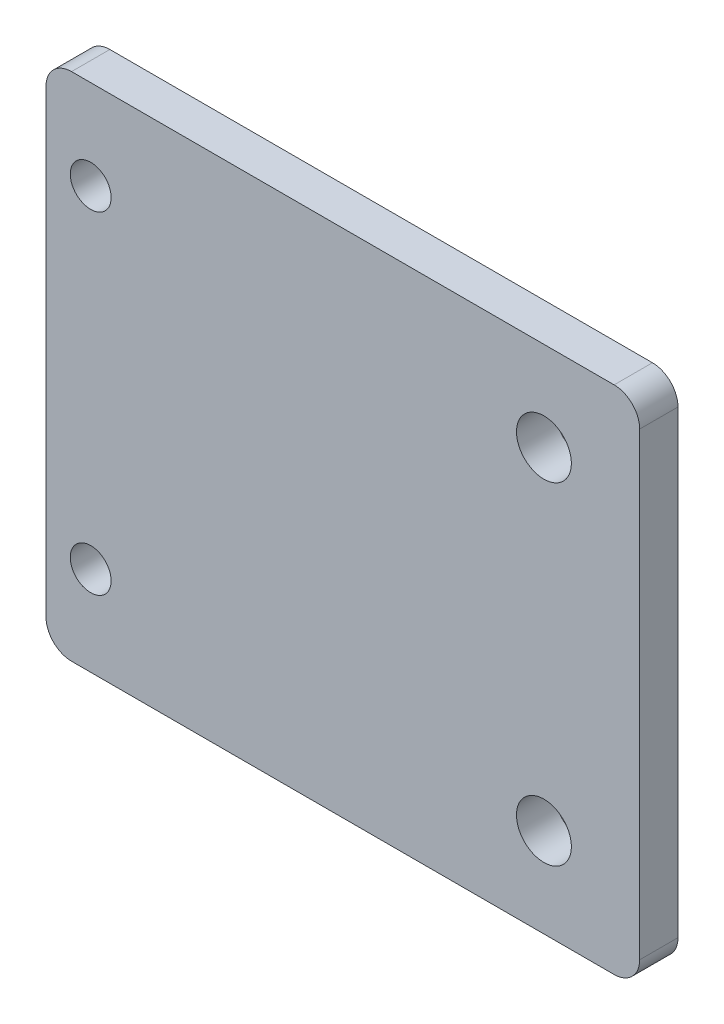
ISO-10303-21;
HEADER;
FILE_DESCRIPTION(('STEP AP214'),'2;1');
FILE_NAME('part.step','',(''),(''),'','','');
FILE_SCHEMA(('AUTOMOTIVE_DESIGN { 1 0 10303 214 1 1 1 1 }'));
ENDSEC;
DATA;
#1=APPLICATION_CONTEXT('core data for automotive mechanical design processes');
#2=APPLICATION_PROTOCOL_DEFINITION('international standard','automotive_design',2000,#1);
#3=PRODUCT_CONTEXT('',#1,'mechanical');
#4=PRODUCT('Part','Part','',(#3));
#5=PRODUCT_RELATED_PRODUCT_CATEGORY('part','',(#4));
#6=PRODUCT_DEFINITION_FORMATION('','',#4);
#7=PRODUCT_DEFINITION_CONTEXT('part definition',#1,'design');
#8=PRODUCT_DEFINITION('design','',#6,#7);
#9=PRODUCT_DEFINITION_SHAPE('','',#8);
#10=(LENGTH_UNIT() NAMED_UNIT(*) SI_UNIT(.MILLI.,.METRE.));
#11=(NAMED_UNIT(*) PLANE_ANGLE_UNIT() SI_UNIT($,.RADIAN.));
#12=(NAMED_UNIT(*) SI_UNIT($,.STERADIAN.) SOLID_ANGLE_UNIT());
#13=UNCERTAINTY_MEASURE_WITH_UNIT(LENGTH_MEASURE(1.E-05),#10,'distance_accuracy_value','');
#14=(GEOMETRIC_REPRESENTATION_CONTEXT(3) GLOBAL_UNCERTAINTY_ASSIGNED_CONTEXT((#13)) GLOBAL_UNIT_ASSIGNED_CONTEXT((#10,
#11,#12)) REPRESENTATION_CONTEXT('',''));
#15=CARTESIAN_POINT('',(0.,0.,0.));
#16=DIRECTION('',(0.,0.,1.));
#17=DIRECTION('',(1.,0.,0.));
#18=AXIS2_PLACEMENT_3D('',#15,#16,#17);
#19=CARTESIAN_POINT('',(-23.25,-20.,3.));
#20=DIRECTION('',(1.,0.,0.));
#21=DIRECTION('',(0.,0.,-1.));
#22=AXIS2_PLACEMENT_3D('',#19,#20,#21);
#23=PLANE('',#22);
#24=DIRECTION('',(0.,-1.,0.));
#25=VECTOR('',#24,1.);
#26=CARTESIAN_POINT('',(-23.25,-20.,0.));
#27=LINE('',#26,#25);
#28=CARTESIAN_POINT('',(-23.25,18.,0.));
#29=VERTEX_POINT('',#28);
#30=CARTESIAN_POINT('',(-23.25,-18.,0.));
#31=VERTEX_POINT('',#30);
#32=EDGE_CURVE('E174',#29,#31,#27,.T.);
#33=ORIENTED_EDGE('',*,*,#32,.T.);
#34=DIRECTION('',(0.,0.,-1.));
#35=VECTOR('',#34,1.);
#36=CARTESIAN_POINT('',(-23.25,-18.,3.));
#37=LINE('',#36,#35);
#38=CARTESIAN_POINT('',(-23.25,-18.,3.));
#39=VERTEX_POINT('',#38);
#40=EDGE_CURVE('E11',#31,#39,#37,.F.);
#41=ORIENTED_EDGE('',*,*,#40,.T.);
#42=DIRECTION('',(0.,-1.,0.));
#43=VECTOR('',#42,1.);
#44=CARTESIAN_POINT('',(-23.25,-20.,3.));
#45=LINE('',#44,#43);
#46=CARTESIAN_POINT('',(-23.25,18.,3.));
#47=VERTEX_POINT('',#46);
#48=EDGE_CURVE('E129',#47,#39,#45,.T.);
#49=ORIENTED_EDGE('',*,*,#48,.F.);
#50=DIRECTION('',(0.,0.,-1.));
#51=VECTOR('',#50,1.);
#52=CARTESIAN_POINT('',(-23.25,18.,3.));
#53=LINE('',#52,#51);
#54=EDGE_CURVE('E45',#47,#29,#53,.T.);
#55=ORIENTED_EDGE('',*,*,#54,.T.);
#56=EDGE_LOOP('',(#33,#41,#49,#55));
#57=FACE_BOUND('',#56,.T.);
#58=ADVANCED_FACE('F37',(#57),#23,.F.);
#59=CARTESIAN_POINT('',(23.25,-20.,3.));
#60=DIRECTION('',(0.,1.,0.));
#61=DIRECTION('',(-1.,0.,0.));
#62=AXIS2_PLACEMENT_3D('',#59,#60,#61);
#63=PLANE('',#62);
#64=DIRECTION('',(1.,0.,0.));
#65=VECTOR('',#64,1.);
#66=CARTESIAN_POINT('',(23.25,-20.,0.));
#67=LINE('',#66,#65);
#68=CARTESIAN_POINT('',(-21.25,-20.,0.));
#69=VERTEX_POINT('',#68);
#70=CARTESIAN_POINT('',(21.25,-20.,0.));
#71=VERTEX_POINT('',#70);
#72=EDGE_CURVE('E134',#69,#71,#67,.T.);
#73=ORIENTED_EDGE('',*,*,#72,.T.);
#74=DIRECTION('',(0.,0.,-1.));
#75=VECTOR('',#74,1.);
#76=CARTESIAN_POINT('',(21.25,-20.,3.));
#77=LINE('',#76,#75);
#78=CARTESIAN_POINT('',(21.25,-20.,3.));
#79=VERTEX_POINT('',#78);
#80=EDGE_CURVE('E52',#71,#79,#77,.F.);
#81=ORIENTED_EDGE('',*,*,#80,.T.);
#82=DIRECTION('',(1.,0.,0.));
#83=VECTOR('',#82,1.);
#84=CARTESIAN_POINT('',(23.25,-20.,3.));
#85=LINE('',#84,#83);
#86=CARTESIAN_POINT('',(-21.25,-20.,3.));
#87=VERTEX_POINT('',#86);
#88=EDGE_CURVE('E132',#87,#79,#85,.T.);
#89=ORIENTED_EDGE('',*,*,#88,.F.);
#90=DIRECTION('',(0.,0.,-1.));
#91=VECTOR('',#90,1.);
#92=CARTESIAN_POINT('',(-21.25,-20.,3.));
#93=LINE('',#92,#91);
#94=EDGE_CURVE('E166',#87,#69,#93,.T.);
#95=ORIENTED_EDGE('',*,*,#94,.T.);
#96=EDGE_LOOP('',(#73,#81,#89,#95));
#97=FACE_BOUND('',#96,.T.);
#98=ADVANCED_FACE('F217',(#97),#63,.F.);
#99=CARTESIAN_POINT('',(23.25,-20.,3.));
#100=DIRECTION('',(-1.,0.,0.));
#101=DIRECTION('',(0.,0.,1.));
#102=AXIS2_PLACEMENT_3D('',#99,#100,#101);
#103=PLANE('',#102);
#104=DIRECTION('',(0.,1.,0.));
#105=VECTOR('',#104,1.);
#106=CARTESIAN_POINT('',(23.25,-20.,0.));
#107=LINE('',#106,#105);
#108=CARTESIAN_POINT('',(23.25,-18.,0.));
#109=VERTEX_POINT('',#108);
#110=CARTESIAN_POINT('',(23.25,18.,0.));
#111=VERTEX_POINT('',#110);
#112=EDGE_CURVE('E130',#109,#111,#107,.T.);
#113=ORIENTED_EDGE('',*,*,#112,.T.);
#114=DIRECTION('',(0.,0.,-1.));
#115=VECTOR('',#114,1.);
#116=CARTESIAN_POINT('',(23.25,18.,3.));
#117=LINE('',#116,#115);
#118=CARTESIAN_POINT('',(23.25,18.,3.));
#119=VERTEX_POINT('',#118);
#120=EDGE_CURVE('E108',#111,#119,#117,.F.);
#121=ORIENTED_EDGE('',*,*,#120,.T.);
#122=DIRECTION('',(0.,1.,0.));
#123=VECTOR('',#122,1.);
#124=CARTESIAN_POINT('',(23.25,-20.,3.));
#125=LINE('',#124,#123);
#126=CARTESIAN_POINT('',(23.25,-18.,3.));
#127=VERTEX_POINT('',#126);
#128=EDGE_CURVE('E185',#127,#119,#125,.T.);
#129=ORIENTED_EDGE('',*,*,#128,.F.);
#130=DIRECTION('',(0.,0.,-1.));
#131=VECTOR('',#130,1.);
#132=CARTESIAN_POINT('',(23.25,-18.,3.));
#133=LINE('',#132,#131);
#134=EDGE_CURVE('E113',#127,#109,#133,.T.);
#135=ORIENTED_EDGE('',*,*,#134,.T.);
#136=EDGE_LOOP('',(#113,#121,#129,#135));
#137=FACE_BOUND('',#136,.T.);
#138=ADVANCED_FACE('F214',(#137),#103,.F.);
#139=CARTESIAN_POINT('',(23.25,20.,3.));
#140=DIRECTION('',(0.,-1.,0.));
#141=DIRECTION('',(1.,0.,0.));
#142=AXIS2_PLACEMENT_3D('',#139,#140,#141);
#143=PLANE('',#142);
#144=DIRECTION('',(-1.,0.,0.));
#145=VECTOR('',#144,1.);
#146=CARTESIAN_POINT('',(23.25,20.,3.));
#147=LINE('',#146,#145);
#148=CARTESIAN_POINT('',(21.25,20.,3.));
#149=VERTEX_POINT('',#148);
#150=CARTESIAN_POINT('',(-21.25,20.,3.));
#151=VERTEX_POINT('',#150);
#152=EDGE_CURVE('E123',#149,#151,#147,.T.);
#153=ORIENTED_EDGE('',*,*,#152,.F.);
#154=DIRECTION('',(0.,0.,-1.));
#155=VECTOR('',#154,1.);
#156=CARTESIAN_POINT('',(21.25,20.,3.));
#157=LINE('',#156,#155);
#158=CARTESIAN_POINT('',(21.25,20.,0.));
#159=VERTEX_POINT('',#158);
#160=EDGE_CURVE('E107',#149,#159,#157,.T.);
#161=ORIENTED_EDGE('',*,*,#160,.T.);
#162=DIRECTION('',(-1.,0.,0.));
#163=VECTOR('',#162,1.);
#164=CARTESIAN_POINT('',(23.25,20.,0.));
#165=LINE('',#164,#163);
#166=CARTESIAN_POINT('',(-21.25,20.,0.));
#167=VERTEX_POINT('',#166);
#168=EDGE_CURVE('E120',#159,#167,#165,.T.);
#169=ORIENTED_EDGE('',*,*,#168,.T.);
#170=DIRECTION('',(0.,0.,-1.));
#171=VECTOR('',#170,1.);
#172=CARTESIAN_POINT('',(-21.25,20.,3.));
#173=LINE('',#172,#171);
#174=EDGE_CURVE('E125',#167,#151,#173,.F.);
#175=ORIENTED_EDGE('',*,*,#174,.T.);
#176=EDGE_LOOP('',(#153,#161,#169,#175));
#177=FACE_BOUND('',#176,.T.);
#178=ADVANCED_FACE('F119',(#177),#143,.F.);
#179=CARTESIAN_POINT('',(0.,0.,3.));
#180=DIRECTION('',(0.,0.,1.));
#181=DIRECTION('',(1.,0.,0.));
#182=AXIS2_PLACEMENT_3D('',#179,#180,#181);
#183=PLANE('',#182);
#184=CARTESIAN_POINT('',(15.75,13.,3.));
#185=DIRECTION('',(0.,0.,1.));
#186=DIRECTION('',(1.,0.,0.));
#187=AXIS2_PLACEMENT_3D('',#184,#185,#186);
#188=CIRCLE('',#187,2.15);
#189=CARTESIAN_POINT('',(17.9,13.,3.));
#190=VERTEX_POINT('',#189);
#191=EDGE_CURVE('E150',#190,#190,#188,.T.);
#192=ORIENTED_EDGE('',*,*,#191,.F.);
#193=EDGE_LOOP('',(#192));
#194=FACE_BOUND('',#193,.T.);
#195=CARTESIAN_POINT('',(15.75,-13.,3.));
#196=DIRECTION('',(0.,0.,1.));
#197=DIRECTION('',(1.,0.,0.));
#198=AXIS2_PLACEMENT_3D('',#195,#196,#197);
#199=CIRCLE('',#198,2.15);
#200=CARTESIAN_POINT('',(17.9,-13.,3.));
#201=VERTEX_POINT('',#200);
#202=EDGE_CURVE('E146',#201,#201,#199,.T.);
#203=ORIENTED_EDGE('',*,*,#202,.F.);
#204=EDGE_LOOP('',(#203));
#205=FACE_BOUND('',#204,.T.);
#206=CARTESIAN_POINT('',(-19.75,13.,3.));
#207=DIRECTION('',(0.,0.,1.));
#208=DIRECTION('',(1.,0.,0.));
#209=AXIS2_PLACEMENT_3D('',#206,#207,#208);
#210=CIRCLE('',#209,1.6);
#211=CARTESIAN_POINT('',(-18.15,13.,3.));
#212=VERTEX_POINT('',#211);
#213=EDGE_CURVE('E142',#212,#212,#210,.T.);
#214=ORIENTED_EDGE('',*,*,#213,.F.);
#215=EDGE_LOOP('',(#214));
#216=FACE_BOUND('',#215,.T.);
#217=CARTESIAN_POINT('',(-19.75,-13.,3.));
#218=DIRECTION('',(0.,0.,1.));
#219=DIRECTION('',(1.,0.,0.));
#220=AXIS2_PLACEMENT_3D('',#217,#218,#219);
#221=CIRCLE('',#220,1.6);
#222=CARTESIAN_POINT('',(-18.15,-13.,3.));
#223=VERTEX_POINT('',#222);
#224=EDGE_CURVE('E141',#223,#223,#221,.T.);
#225=ORIENTED_EDGE('',*,*,#224,.F.);
#226=EDGE_LOOP('',(#225));
#227=FACE_BOUND('',#226,.T.);
#228=ORIENTED_EDGE('',*,*,#128,.T.);
#229=CARTESIAN_POINT('',(21.25,18.,3.));
#230=DIRECTION('',(0.,0.,1.));
#231=DIRECTION('',(1.,0.,0.));
#232=AXIS2_PLACEMENT_3D('',#229,#230,#231);
#233=CIRCLE('',#232,2.);
#234=EDGE_CURVE('E164',#119,#149,#233,.T.);
#235=ORIENTED_EDGE('',*,*,#234,.T.);
#236=ORIENTED_EDGE('',*,*,#152,.T.);
#237=CARTESIAN_POINT('',(-21.25,18.,3.));
#238=DIRECTION('',(0.,0.,1.));
#239=DIRECTION('',(1.,0.,0.));
#240=AXIS2_PLACEMENT_3D('',#237,#238,#239);
#241=CIRCLE('',#240,2.);
#242=EDGE_CURVE('E159',#151,#47,#241,.T.);
#243=ORIENTED_EDGE('',*,*,#242,.T.);
#244=ORIENTED_EDGE('',*,*,#48,.T.);
#245=CARTESIAN_POINT('',(-21.25,-18.,3.));
#246=DIRECTION('',(0.,0.,1.));
#247=DIRECTION('',(1.,0.,0.));
#248=AXIS2_PLACEMENT_3D('',#245,#246,#247);
#249=CIRCLE('',#248,2.);
#250=EDGE_CURVE('E59',#39,#87,#249,.T.);
#251=ORIENTED_EDGE('',*,*,#250,.T.);
#252=ORIENTED_EDGE('',*,*,#88,.T.);
#253=CARTESIAN_POINT('',(21.25,-18.,3.));
#254=DIRECTION('',(0.,0.,1.));
#255=DIRECTION('',(1.,0.,0.));
#256=AXIS2_PLACEMENT_3D('',#253,#254,#255);
#257=CIRCLE('',#256,2.);
#258=EDGE_CURVE('E162',#79,#127,#257,.T.);
#259=ORIENTED_EDGE('',*,*,#258,.T.);
#260=EDGE_LOOP('',(#228,#235,#236,#243,#244,#251,#252,#259));
#261=FACE_BOUND('',#260,.T.);
#262=ADVANCED_FACE('F201',(#194,#205,#216,#227,#261),#183,.T.);
#263=CARTESIAN_POINT('',(0.,0.,0.));
#264=DIRECTION('',(0.,0.,1.));
#265=DIRECTION('',(1.,0.,0.));
#266=AXIS2_PLACEMENT_3D('',#263,#264,#265);
#267=PLANE('',#266);
#268=CARTESIAN_POINT('',(15.75,13.,0.));
#269=DIRECTION('',(0.,0.,1.));
#270=DIRECTION('',(1.,0.,0.));
#271=AXIS2_PLACEMENT_3D('',#268,#269,#270);
#272=CIRCLE('',#271,2.15);
#273=CARTESIAN_POINT('',(17.9,13.,0.));
#274=VERTEX_POINT('',#273);
#275=EDGE_CURVE('E147',#274,#274,#272,.T.);
#276=ORIENTED_EDGE('',*,*,#275,.T.);
#277=EDGE_LOOP('',(#276));
#278=FACE_BOUND('',#277,.T.);
#279=CARTESIAN_POINT('',(15.75,-13.,0.));
#280=DIRECTION('',(0.,0.,1.));
#281=DIRECTION('',(1.,0.,0.));
#282=AXIS2_PLACEMENT_3D('',#279,#280,#281);
#283=CIRCLE('',#282,2.15);
#284=CARTESIAN_POINT('',(17.9,-13.,0.));
#285=VERTEX_POINT('',#284);
#286=EDGE_CURVE('E143',#285,#285,#283,.T.);
#287=ORIENTED_EDGE('',*,*,#286,.T.);
#288=EDGE_LOOP('',(#287));
#289=FACE_BOUND('',#288,.T.);
#290=CARTESIAN_POINT('',(-19.75,13.,0.));
#291=DIRECTION('',(0.,0.,1.));
#292=DIRECTION('',(1.,0.,0.));
#293=AXIS2_PLACEMENT_3D('',#290,#291,#292);
#294=CIRCLE('',#293,1.6);
#295=CARTESIAN_POINT('',(-18.15,13.,0.));
#296=VERTEX_POINT('',#295);
#297=EDGE_CURVE('E138',#296,#296,#294,.T.);
#298=ORIENTED_EDGE('',*,*,#297,.T.);
#299=EDGE_LOOP('',(#298));
#300=FACE_BOUND('',#299,.T.);
#301=CARTESIAN_POINT('',(-19.75,-13.,0.));
#302=DIRECTION('',(0.,0.,1.));
#303=DIRECTION('',(1.,0.,0.));
#304=AXIS2_PLACEMENT_3D('',#301,#302,#303);
#305=CIRCLE('',#304,1.6);
#306=CARTESIAN_POINT('',(-18.15,-13.,0.));
#307=VERTEX_POINT('',#306);
#308=EDGE_CURVE('E179',#307,#307,#305,.T.);
#309=ORIENTED_EDGE('',*,*,#308,.T.);
#310=EDGE_LOOP('',(#309));
#311=FACE_BOUND('',#310,.T.);
#312=ORIENTED_EDGE('',*,*,#168,.F.);
#313=CARTESIAN_POINT('',(21.25,18.,0.));
#314=DIRECTION('',(0.,0.,1.));
#315=DIRECTION('',(1.,0.,0.));
#316=AXIS2_PLACEMENT_3D('',#313,#314,#315);
#317=CIRCLE('',#316,2.);
#318=EDGE_CURVE('E103',#159,#111,#317,.F.);
#319=ORIENTED_EDGE('',*,*,#318,.T.);
#320=ORIENTED_EDGE('',*,*,#112,.F.);
#321=CARTESIAN_POINT('',(21.25,-18.,0.));
#322=DIRECTION('',(0.,0.,1.));
#323=DIRECTION('',(1.,0.,0.));
#324=AXIS2_PLACEMENT_3D('',#321,#322,#323);
#325=CIRCLE('',#324,2.);
#326=EDGE_CURVE('E114',#109,#71,#325,.F.);
#327=ORIENTED_EDGE('',*,*,#326,.T.);
#328=ORIENTED_EDGE('',*,*,#72,.F.);
#329=CARTESIAN_POINT('',(-21.25,-18.,0.));
#330=DIRECTION('',(0.,0.,1.));
#331=DIRECTION('',(1.,0.,0.));
#332=AXIS2_PLACEMENT_3D('',#329,#330,#331);
#333=CIRCLE('',#332,2.);
#334=EDGE_CURVE('E153',#69,#31,#333,.F.);
#335=ORIENTED_EDGE('',*,*,#334,.T.);
#336=ORIENTED_EDGE('',*,*,#32,.F.);
#337=CARTESIAN_POINT('',(-21.25,18.,0.));
#338=DIRECTION('',(0.,0.,1.));
#339=DIRECTION('',(1.,0.,0.));
#340=AXIS2_PLACEMENT_3D('',#337,#338,#339);
#341=CIRCLE('',#340,2.);
#342=EDGE_CURVE('E124',#29,#167,#341,.F.);
#343=ORIENTED_EDGE('',*,*,#342,.T.);
#344=EDGE_LOOP('',(#312,#319,#320,#327,#328,#335,#336,#343));
#345=FACE_BOUND('',#344,.T.);
#346=ADVANCED_FACE('F127',(#278,#289,#300,#311,#345),#267,.F.);
#347=CARTESIAN_POINT('',(-19.75,-13.,3.));
#348=DIRECTION('',(0.,0.,1.));
#349=DIRECTION('',(1.,0.,0.));
#350=AXIS2_PLACEMENT_3D('',#347,#348,#349);
#351=CYLINDRICAL_SURFACE('',#350,1.6);
#352=ORIENTED_EDGE('',*,*,#224,.T.);
#353=EDGE_LOOP('',(#352));
#354=FACE_BOUND('',#353,.T.);
#355=ORIENTED_EDGE('',*,*,#308,.F.);
#356=EDGE_LOOP('',(#355));
#357=FACE_BOUND('',#356,.T.);
#358=ADVANCED_FACE('F289',(#354,#357),#351,.F.);
#359=CARTESIAN_POINT('',(-19.75,13.,3.));
#360=DIRECTION('',(0.,0.,1.));
#361=DIRECTION('',(1.,0.,0.));
#362=AXIS2_PLACEMENT_3D('',#359,#360,#361);
#363=CYLINDRICAL_SURFACE('',#362,1.6);
#364=ORIENTED_EDGE('',*,*,#213,.T.);
#365=EDGE_LOOP('',(#364));
#366=FACE_BOUND('',#365,.T.);
#367=ORIENTED_EDGE('',*,*,#297,.F.);
#368=EDGE_LOOP('',(#367));
#369=FACE_BOUND('',#368,.T.);
#370=ADVANCED_FACE('F279',(#366,#369),#363,.F.);
#371=CARTESIAN_POINT('',(15.75,-13.,3.));
#372=DIRECTION('',(0.,0.,1.));
#373=DIRECTION('',(1.,0.,0.));
#374=AXIS2_PLACEMENT_3D('',#371,#372,#373);
#375=CYLINDRICAL_SURFACE('',#374,2.15);
#376=ORIENTED_EDGE('',*,*,#202,.T.);
#377=EDGE_LOOP('',(#376));
#378=FACE_BOUND('',#377,.T.);
#379=ORIENTED_EDGE('',*,*,#286,.F.);
#380=EDGE_LOOP('',(#379));
#381=FACE_BOUND('',#380,.T.);
#382=ADVANCED_FACE('F270',(#378,#381),#375,.F.);
#383=CARTESIAN_POINT('',(15.75,13.,3.));
#384=DIRECTION('',(0.,0.,1.));
#385=DIRECTION('',(1.,0.,0.));
#386=AXIS2_PLACEMENT_3D('',#383,#384,#385);
#387=CYLINDRICAL_SURFACE('',#386,2.15);
#388=ORIENTED_EDGE('',*,*,#191,.T.);
#389=EDGE_LOOP('',(#388));
#390=FACE_BOUND('',#389,.T.);
#391=ORIENTED_EDGE('',*,*,#275,.F.);
#392=EDGE_LOOP('',(#391));
#393=FACE_BOUND('',#392,.T.);
#394=ADVANCED_FACE('F198',(#390,#393),#387,.F.);
#395=CARTESIAN_POINT('',(21.25,18.,3.));
#396=DIRECTION('',(0.,0.,-1.));
#397=DIRECTION('',(-1.,0.,0.));
#398=AXIS2_PLACEMENT_3D('',#395,#396,#397);
#399=CYLINDRICAL_SURFACE('',#398,2.);
#400=ORIENTED_EDGE('',*,*,#234,.F.);
#401=ORIENTED_EDGE('',*,*,#120,.F.);
#402=ORIENTED_EDGE('',*,*,#318,.F.);
#403=ORIENTED_EDGE('',*,*,#160,.F.);
#404=EDGE_LOOP('',(#400,#401,#402,#403));
#405=FACE_BOUND('',#404,.T.);
#406=ADVANCED_FACE('F106',(#405),#399,.T.);
#407=CARTESIAN_POINT('',(21.25,-18.,3.));
#408=DIRECTION('',(0.,0.,-1.));
#409=DIRECTION('',(-1.,0.,0.));
#410=AXIS2_PLACEMENT_3D('',#407,#408,#409);
#411=CYLINDRICAL_SURFACE('',#410,2.);
#412=ORIENTED_EDGE('',*,*,#258,.F.);
#413=ORIENTED_EDGE('',*,*,#80,.F.);
#414=ORIENTED_EDGE('',*,*,#326,.F.);
#415=ORIENTED_EDGE('',*,*,#134,.F.);
#416=EDGE_LOOP('',(#412,#413,#414,#415));
#417=FACE_BOUND('',#416,.T.);
#418=ADVANCED_FACE('F216',(#417),#411,.T.);
#419=CARTESIAN_POINT('',(-21.25,-18.,3.));
#420=DIRECTION('',(0.,0.,-1.));
#421=DIRECTION('',(-1.,0.,0.));
#422=AXIS2_PLACEMENT_3D('',#419,#420,#421);
#423=CYLINDRICAL_SURFACE('',#422,2.);
#424=ORIENTED_EDGE('',*,*,#250,.F.);
#425=ORIENTED_EDGE('',*,*,#40,.F.);
#426=ORIENTED_EDGE('',*,*,#334,.F.);
#427=ORIENTED_EDGE('',*,*,#94,.F.);
#428=EDGE_LOOP('',(#424,#425,#426,#427));
#429=FACE_BOUND('',#428,.T.);
#430=ADVANCED_FACE('F220',(#429),#423,.T.);
#431=CARTESIAN_POINT('',(-21.25,18.,3.));
#432=DIRECTION('',(0.,0.,-1.));
#433=DIRECTION('',(-1.,0.,0.));
#434=AXIS2_PLACEMENT_3D('',#431,#432,#433);
#435=CYLINDRICAL_SURFACE('',#434,2.);
#436=ORIENTED_EDGE('',*,*,#242,.F.);
#437=ORIENTED_EDGE('',*,*,#174,.F.);
#438=ORIENTED_EDGE('',*,*,#342,.F.);
#439=ORIENTED_EDGE('',*,*,#54,.F.);
#440=EDGE_LOOP('',(#436,#437,#438,#439));
#441=FACE_BOUND('',#440,.T.);
#442=ADVANCED_FACE('F39',(#441),#435,.T.);
#443=CLOSED_SHELL('',(#58,#98,#138,#178,#262,#346,#358,#370,#382,#394,#406,#418,#430,#442));
#444=MANIFOLD_SOLID_BREP('B2',#443);
#445=ADVANCED_BREP_SHAPE_REPRESENTATION('',(#18,#444),#14);
#446=SHAPE_DEFINITION_REPRESENTATION(#9,#445);
ENDSEC;
END-ISO-10303-21;
